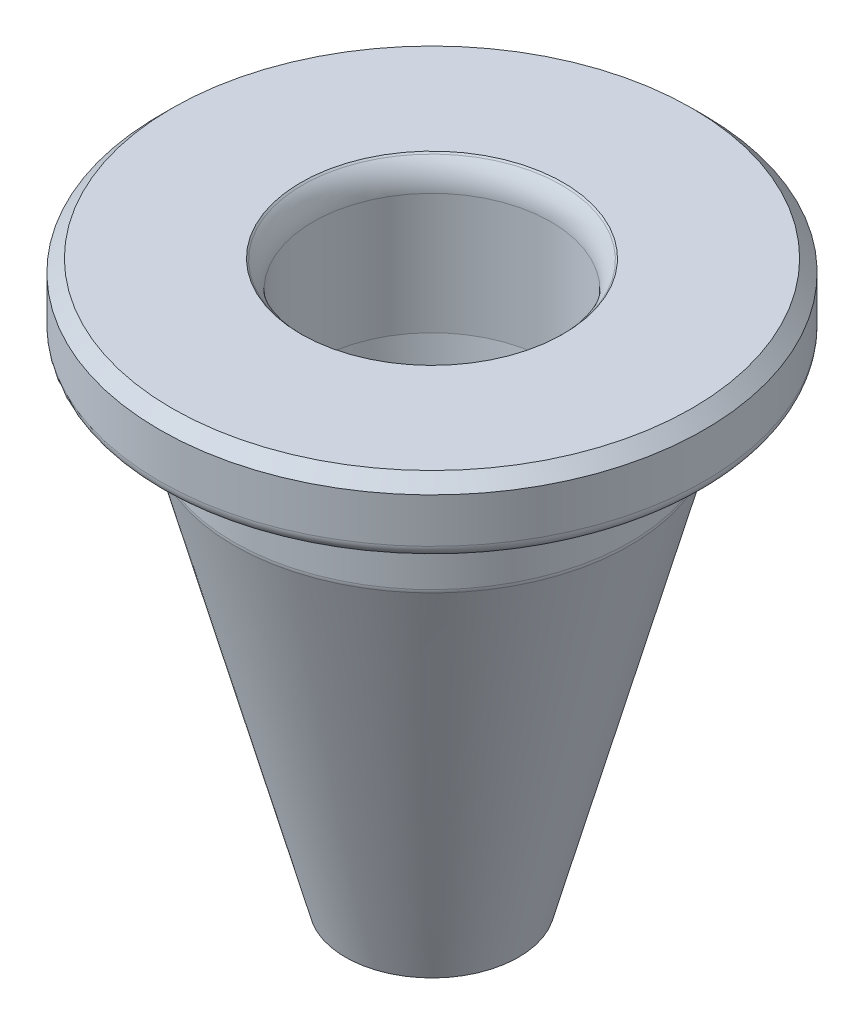
ISO-10303-21;
HEADER;
FILE_DESCRIPTION(('STEP AP214'),'2;1');
FILE_NAME('part.step','',(''),(''),'','','');
FILE_SCHEMA(('AUTOMOTIVE_DESIGN { 1 0 10303 214 1 1 1 1 }'));
ENDSEC;
DATA;
#1=APPLICATION_CONTEXT('core data for automotive mechanical design processes');
#2=APPLICATION_PROTOCOL_DEFINITION('international standard','automotive_design',2000,#1);
#3=PRODUCT_CONTEXT('',#1,'mechanical');
#4=PRODUCT('Part','Part','',(#3));
#5=PRODUCT_RELATED_PRODUCT_CATEGORY('part','',(#4));
#6=PRODUCT_DEFINITION_FORMATION('','',#4);
#7=PRODUCT_DEFINITION_CONTEXT('part definition',#1,'design');
#8=PRODUCT_DEFINITION('design','',#6,#7);
#9=PRODUCT_DEFINITION_SHAPE('','',#8);
#10=(LENGTH_UNIT() NAMED_UNIT(*) SI_UNIT(.MILLI.,.METRE.));
#11=(NAMED_UNIT(*) PLANE_ANGLE_UNIT() SI_UNIT($,.RADIAN.));
#12=(NAMED_UNIT(*) SI_UNIT($,.STERADIAN.) SOLID_ANGLE_UNIT());
#13=UNCERTAINTY_MEASURE_WITH_UNIT(LENGTH_MEASURE(1.E-05),#10,'distance_accuracy_value','');
#14=(GEOMETRIC_REPRESENTATION_CONTEXT(3) GLOBAL_UNCERTAINTY_ASSIGNED_CONTEXT((#13)) GLOBAL_UNIT_ASSIGNED_CONTEXT((#10,
#11,#12)) REPRESENTATION_CONTEXT('',''));
#15=CARTESIAN_POINT('',(0.,0.,0.));
#16=DIRECTION('',(0.,0.,1.));
#17=DIRECTION('',(1.,0.,0.));
#18=AXIS2_PLACEMENT_3D('',#15,#16,#17);
#19=CARTESIAN_POINT('',(0.,0.,0.));
#20=DIRECTION('',(0.,-1.,0.));
#21=DIRECTION('',(0.,0.,-1.));
#22=AXIS2_PLACEMENT_3D('',#19,#20,#21);
#23=CYLINDRICAL_SURFACE('',#22,8.);
#24=CARTESIAN_POINT('',(0.,19.7,0.));
#25=DIRECTION('',(0.,1.,0.));
#26=DIRECTION('',(0.,0.,1.));
#27=AXIS2_PLACEMENT_3D('',#24,#25,#26);
#28=CIRCLE('',#27,8.);
#29=CARTESIAN_POINT('',(0.,19.7,8.));
#30=VERTEX_POINT('',#29);
#31=EDGE_CURVE('E66',#30,#30,#28,.F.);
#32=ORIENTED_EDGE('',*,*,#31,.T.);
#33=EDGE_LOOP('',(#32));
#34=FACE_BOUND('',#33,.T.);
#35=CARTESIAN_POINT('',(0.,17.0661849107283,0.));
#36=DIRECTION('',(0.,1.,0.));
#37=DIRECTION('',(0.,0.,1.));
#38=AXIS2_PLACEMENT_3D('',#35,#36,#37);
#39=CIRCLE('',#38,8.);
#40=CARTESIAN_POINT('',(0.,17.0661849107283,8.));
#41=VERTEX_POINT('',#40);
#42=EDGE_CURVE('E69',#41,#41,#39,.T.);
#43=ORIENTED_EDGE('',*,*,#42,.T.);
#44=EDGE_LOOP('',(#43));
#45=FACE_BOUND('',#44,.T.);
#46=ADVANCED_FACE('F40',(#34,#45),#23,.T.);
#47=CARTESIAN_POINT('',(0.,0.,0.));
#48=DIRECTION('',(0.,1.,0.));
#49=DIRECTION('',(0.,0.,1.));
#50=AXIS2_PLACEMENT_3D('',#47,#48,#49);
#51=CONICAL_SURFACE('',#50,3.,1.03037682652431);
#52=CARTESIAN_POINT('',(0.,0.3,0.));
#53=DIRECTION('',(0.,-1.,0.));
#54=DIRECTION('',(0.,0.,-1.));
#55=AXIS2_PLACEMENT_3D('',#52,#53,#54);
#56=CIRCLE('',#55,3.5);
#57=CARTESIAN_POINT('',(0.,0.3,-3.5));
#58=VERTEX_POINT('',#57);
#59=EDGE_CURVE('E87',#58,#58,#56,.T.);
#60=ORIENTED_EDGE('',*,*,#59,.T.);
#61=EDGE_LOOP('',(#60));
#62=FACE_BOUND('',#61,.T.);
#63=CARTESIAN_POINT('',(0.,0.,0.));
#64=DIRECTION('',(0.,-1.,0.));
#65=DIRECTION('',(0.,0.,-1.));
#66=AXIS2_PLACEMENT_3D('',#63,#64,#65);
#67=CIRCLE('',#66,3.);
#68=CARTESIAN_POINT('',(0.,0.,-3.));
#69=VERTEX_POINT('',#68);
#70=EDGE_CURVE('E81',#69,#69,#67,.T.);
#71=ORIENTED_EDGE('',*,*,#70,.F.);
#72=EDGE_LOOP('',(#71));
#73=FACE_BOUND('',#72,.T.);
#74=ADVANCED_FACE('F91',(#62,#73),#51,.T.);
#75=CARTESIAN_POINT('',(0.,17.,0.));
#76=DIRECTION('',(0.,1.,0.));
#77=DIRECTION('',(0.,0.,1.));
#78=AXIS2_PLACEMENT_3D('',#75,#76,#77);
#79=CONICAL_SURFACE('',#78,4.8,0.105489308525091);
#80=ORIENTED_EDGE('',*,*,#70,.T.);
#81=EDGE_LOOP('',(#80));
#82=FACE_BOUND('',#81,.T.);
#83=CARTESIAN_POINT('',(0.,17.,0.));
#84=DIRECTION('',(0.,-1.,0.));
#85=DIRECTION('',(0.,0.,-1.));
#86=AXIS2_PLACEMENT_3D('',#83,#84,#85);
#87=CIRCLE('',#86,4.8);
#88=CARTESIAN_POINT('',(0.,17.,-4.8));
#89=VERTEX_POINT('',#88);
#90=EDGE_CURVE('E84',#89,#89,#87,.T.);
#91=ORIENTED_EDGE('',*,*,#90,.F.);
#92=EDGE_LOOP('',(#91));
#93=FACE_BOUND('',#92,.T.);
#94=ADVANCED_FACE('F118',(#82,#93),#79,.F.);
#95=CARTESIAN_POINT('',(0.,0.,0.));
#96=DIRECTION('',(0.,-1.,0.));
#97=DIRECTION('',(0.,0.,-1.));
#98=AXIS2_PLACEMENT_3D('',#95,#96,#97);
#99=CYLINDRICAL_SURFACE('',#98,4.8);
#100=CARTESIAN_POINT('',(0.,21.8786796564404,0.));
#101=DIRECTION('',(0.,-1.,0.));
#102=DIRECTION('',(0.,0.,-1.));
#103=AXIS2_PLACEMENT_3D('',#100,#101,#102);
#104=CIRCLE('',#103,4.8);
#105=CARTESIAN_POINT('',(0.,21.8786796564404,-4.8));
#106=VERTEX_POINT('',#105);
#107=EDGE_CURVE('E47',#106,#106,#104,.F.);
#108=ORIENTED_EDGE('',*,*,#107,.T.);
#109=EDGE_LOOP('',(#108));
#110=FACE_BOUND('',#109,.T.);
#111=ORIENTED_EDGE('',*,*,#90,.T.);
#112=EDGE_LOOP('',(#111));
#113=FACE_BOUND('',#112,.T.);
#114=ADVANCED_FACE('F109',(#110,#113),#99,.F.);
#115=CARTESIAN_POINT('',(4.8,23.,0.));
#116=DIRECTION('',(0.,1.,0.));
#117=DIRECTION('',(0.,0.,1.));
#118=AXIS2_PLACEMENT_3D('',#115,#116,#117);
#119=PLANE('',#118);
#120=CARTESIAN_POINT('',(0.,23.,0.));
#121=DIRECTION('',(0.,1.,0.));
#122=DIRECTION('',(0.,0.,1.));
#123=AXIS2_PLACEMENT_3D('',#120,#121,#122);
#124=CIRCLE('',#123,5.3);
#125=CARTESIAN_POINT('',(0.,23.,5.3));
#126=VERTEX_POINT('',#125);
#127=EDGE_CURVE('E55',#126,#126,#124,.F.);
#128=ORIENTED_EDGE('',*,*,#127,.T.);
#129=EDGE_LOOP('',(#128));
#130=FACE_BOUND('',#129,.T.);
#131=CARTESIAN_POINT('',(0.,23.,0.));
#132=DIRECTION('',(0.,1.,0.));
#133=DIRECTION('',(0.,0.,1.));
#134=AXIS2_PLACEMENT_3D('',#131,#132,#133);
#135=CIRCLE('',#134,10.5);
#136=CARTESIAN_POINT('',(0.,23.,10.5));
#137=VERTEX_POINT('',#136);
#138=EDGE_CURVE('E60',#137,#137,#135,.T.);
#139=ORIENTED_EDGE('',*,*,#138,.T.);
#140=EDGE_LOOP('',(#139));
#141=FACE_BOUND('',#140,.T.);
#142=ADVANCED_FACE('F97',(#130,#141),#119,.T.);
#143=CARTESIAN_POINT('',(0.,0.3,0.));
#144=DIRECTION('',(0.,1.,0.));
#145=DIRECTION('',(0.,0.,1.));
#146=AXIS2_PLACEMENT_3D('',#143,#144,#145);
#147=CONICAL_SURFACE('',#146,3.5,0.263209462190825);
#148=CARTESIAN_POINT('',(0.,16.9360945034199,0.));
#149=DIRECTION('',(0.,-1.,0.));
#150=DIRECTION('',(0.,0.,-1.));
#151=AXIS2_PLACEMENT_3D('',#148,#149,#150);
#152=CIRCLE('',#151,7.98277995601135);
#153=CARTESIAN_POINT('',(0.,16.9360945034199,-7.98277995601135));
#154=VERTEX_POINT('',#153);
#155=EDGE_CURVE('E63',#154,#154,#152,.T.);
#156=ORIENTED_EDGE('',*,*,#155,.T.);
#157=EDGE_LOOP('',(#156));
#158=FACE_BOUND('',#157,.T.);
#159=ORIENTED_EDGE('',*,*,#59,.F.);
#160=EDGE_LOOP('',(#159));
#161=FACE_BOUND('',#160,.T.);
#162=ADVANCED_FACE('F94',(#158,#161),#147,.T.);
#163=CARTESIAN_POINT('',(0.,20.2,0.));
#164=DIRECTION('',(0.,1.,0.));
#165=DIRECTION('',(0.,0.,1.));
#166=AXIS2_PLACEMENT_3D('',#163,#164,#165);
#167=CYLINDRICAL_SURFACE('',#166,11.);
#168=CARTESIAN_POINT('',(0.,22.5,0.));
#169=DIRECTION('',(0.,1.,0.));
#170=DIRECTION('',(0.,0.,1.));
#171=AXIS2_PLACEMENT_3D('',#168,#169,#170);
#172=CIRCLE('',#171,11.);
#173=CARTESIAN_POINT('',(0.,22.5,11.));
#174=VERTEX_POINT('',#173);
#175=EDGE_CURVE('E51',#174,#174,#172,.F.);
#176=ORIENTED_EDGE('',*,*,#175,.T.);
#177=EDGE_LOOP('',(#176));
#178=FACE_BOUND('',#177,.T.);
#179=CARTESIAN_POINT('',(0.,20.7,0.));
#180=DIRECTION('',(0.,1.,0.));
#181=DIRECTION('',(0.,0.,1.));
#182=AXIS2_PLACEMENT_3D('',#179,#180,#181);
#183=CIRCLE('',#182,11.);
#184=CARTESIAN_POINT('',(0.,20.7,11.));
#185=VERTEX_POINT('',#184);
#186=EDGE_CURVE('E78',#185,#185,#183,.T.);
#187=ORIENTED_EDGE('',*,*,#186,.T.);
#188=EDGE_LOOP('',(#187));
#189=FACE_BOUND('',#188,.T.);
#190=ADVANCED_FACE('F96',(#178,#189),#167,.T.);
#191=CARTESIAN_POINT('',(0.,20.2,0.));
#192=DIRECTION('',(0.,1.,0.));
#193=DIRECTION('',(0.,0.,1.));
#194=AXIS2_PLACEMENT_3D('',#191,#192,#193);
#195=PLANE('',#194);
#196=CARTESIAN_POINT('',(0.,20.2,0.));
#197=DIRECTION('',(0.,1.,0.));
#198=DIRECTION('',(0.,0.,1.));
#199=AXIS2_PLACEMENT_3D('',#196,#197,#198);
#200=CIRCLE('',#199,10.5);
#201=CARTESIAN_POINT('',(0.,20.2,10.5));
#202=VERTEX_POINT('',#201);
#203=EDGE_CURVE('E72',#202,#202,#200,.F.);
#204=ORIENTED_EDGE('',*,*,#203,.T.);
#205=EDGE_LOOP('',(#204));
#206=FACE_BOUND('',#205,.T.);
#207=CARTESIAN_POINT('',(0.,20.2,0.));
#208=DIRECTION('',(0.,1.,0.));
#209=DIRECTION('',(0.,0.,1.));
#210=AXIS2_PLACEMENT_3D('',#207,#208,#209);
#211=CIRCLE('',#210,8.5);
#212=CARTESIAN_POINT('',(0.,20.2,8.5));
#213=VERTEX_POINT('',#212);
#214=EDGE_CURVE('E75',#213,#213,#211,.T.);
#215=ORIENTED_EDGE('',*,*,#214,.T.);
#216=EDGE_LOOP('',(#215));
#217=FACE_BOUND('',#216,.T.);
#218=ADVANCED_FACE('F105',(#206,#217),#195,.F.);
#219=CARTESIAN_POINT('',(0.,20.7,0.));
#220=DIRECTION('',(0.,1.,0.));
#221=DIRECTION('',(0.,0.,1.));
#222=AXIS2_PLACEMENT_3D('',#219,#220,#221);
#223=TOROIDAL_SURFACE('',#222,10.5,0.5);
#224=ORIENTED_EDGE('',*,*,#203,.F.);
#225=EDGE_LOOP('',(#224));
#226=FACE_BOUND('',#225,.T.);
#227=ORIENTED_EDGE('',*,*,#186,.F.);
#228=EDGE_LOOP('',(#227));
#229=FACE_BOUND('',#228,.T.);
#230=ADVANCED_FACE('F126',(#226,#229),#223,.T.);
#231=CARTESIAN_POINT('',(0.,19.7,0.));
#232=DIRECTION('',(0.,1.,0.));
#233=DIRECTION('',(0.,0.,1.));
#234=AXIS2_PLACEMENT_3D('',#231,#232,#233);
#235=TOROIDAL_SURFACE('',#234,8.5,0.5);
#236=ORIENTED_EDGE('',*,*,#214,.F.);
#237=EDGE_LOOP('',(#236));
#238=FACE_BOUND('',#237,.T.);
#239=ORIENTED_EDGE('',*,*,#31,.F.);
#240=EDGE_LOOP('',(#239));
#241=FACE_BOUND('',#240,.T.);
#242=ADVANCED_FACE('F129',(#238,#241),#235,.F.);
#243=CARTESIAN_POINT('',(0.,17.0661849107283,0.));
#244=DIRECTION('',(0.,1.,0.));
#245=DIRECTION('',(0.,0.,1.));
#246=AXIS2_PLACEMENT_3D('',#243,#244,#245);
#247=TOROIDAL_SURFACE('',#246,7.5,0.5);
#248=ORIENTED_EDGE('',*,*,#42,.F.);
#249=EDGE_LOOP('',(#248));
#250=FACE_BOUND('',#249,.T.);
#251=ORIENTED_EDGE('',*,*,#155,.F.);
#252=EDGE_LOOP('',(#251));
#253=FACE_BOUND('',#252,.T.);
#254=ADVANCED_FACE('F133',(#250,#253),#247,.T.);
#255=CARTESIAN_POINT('',(0.,23.,0.));
#256=DIRECTION('',(0.,1.,0.));
#257=DIRECTION('',(0.,0.,1.));
#258=AXIS2_PLACEMENT_3D('',#255,#256,#257);
#259=CONICAL_SURFACE('',#258,5.3,0.785398163397448);
#260=CARTESIAN_POINT('',(0.,22.9393398282202,0.));
#261=DIRECTION('',(0.,-1.,0.));
#262=DIRECTION('',(0.,0.,-1.));
#263=AXIS2_PLACEMENT_3D('',#260,#261,#262);
#264=CIRCLE('',#263,5.23933982822018);
#265=CARTESIAN_POINT('',(0.,22.9393398282202,-5.23933982822018));
#266=VERTEX_POINT('',#265);
#267=EDGE_CURVE('E11',#266,#266,#264,.T.);
#268=ORIENTED_EDGE('',*,*,#267,.T.);
#269=EDGE_LOOP('',(#268));
#270=FACE_BOUND('',#269,.T.);
#271=ORIENTED_EDGE('',*,*,#127,.F.);
#272=EDGE_LOOP('',(#271));
#273=FACE_BOUND('',#272,.T.);
#274=ADVANCED_FACE('F137',(#270,#273),#259,.F.);
#275=CARTESIAN_POINT('',(0.,23.,0.));
#276=DIRECTION('',(0.,-1.,0.));
#277=DIRECTION('',(0.,0.,-1.));
#278=AXIS2_PLACEMENT_3D('',#275,#276,#277);
#279=CONICAL_SURFACE('',#278,10.5,0.785398163397452);
#280=ORIENTED_EDGE('',*,*,#175,.F.);
#281=EDGE_LOOP('',(#280));
#282=FACE_BOUND('',#281,.T.);
#283=ORIENTED_EDGE('',*,*,#138,.F.);
#284=EDGE_LOOP('',(#283));
#285=FACE_BOUND('',#284,.T.);
#286=ADVANCED_FACE('F144',(#282,#285),#279,.T.);
#287=CARTESIAN_POINT('',(0.,21.8786796564404,0.));
#288=DIRECTION('',(0.,-1.,0.));
#289=DIRECTION('',(0.,0.,-1.));
#290=AXIS2_PLACEMENT_3D('',#287,#288,#289);
#291=TOROIDAL_SURFACE('',#290,6.3,1.5);
#292=ORIENTED_EDGE('',*,*,#267,.F.);
#293=EDGE_LOOP('',(#292));
#294=FACE_BOUND('',#293,.T.);
#295=ORIENTED_EDGE('',*,*,#107,.F.);
#296=EDGE_LOOP('',(#295));
#297=FACE_BOUND('',#296,.T.);
#298=ADVANCED_FACE('F42',(#294,#297),#291,.T.);
#299=CLOSED_SHELL('',(#46,#74,#94,#114,#142,#162,#190,#218,#230,#242,#254,#274,#286,#298));
#300=MANIFOLD_SOLID_BREP('B2',#299);
#301=ADVANCED_BREP_SHAPE_REPRESENTATION('',(#18,#300),#14);
#302=SHAPE_DEFINITION_REPRESENTATION(#9,#301);
ENDSEC;
END-ISO-10303-21;
